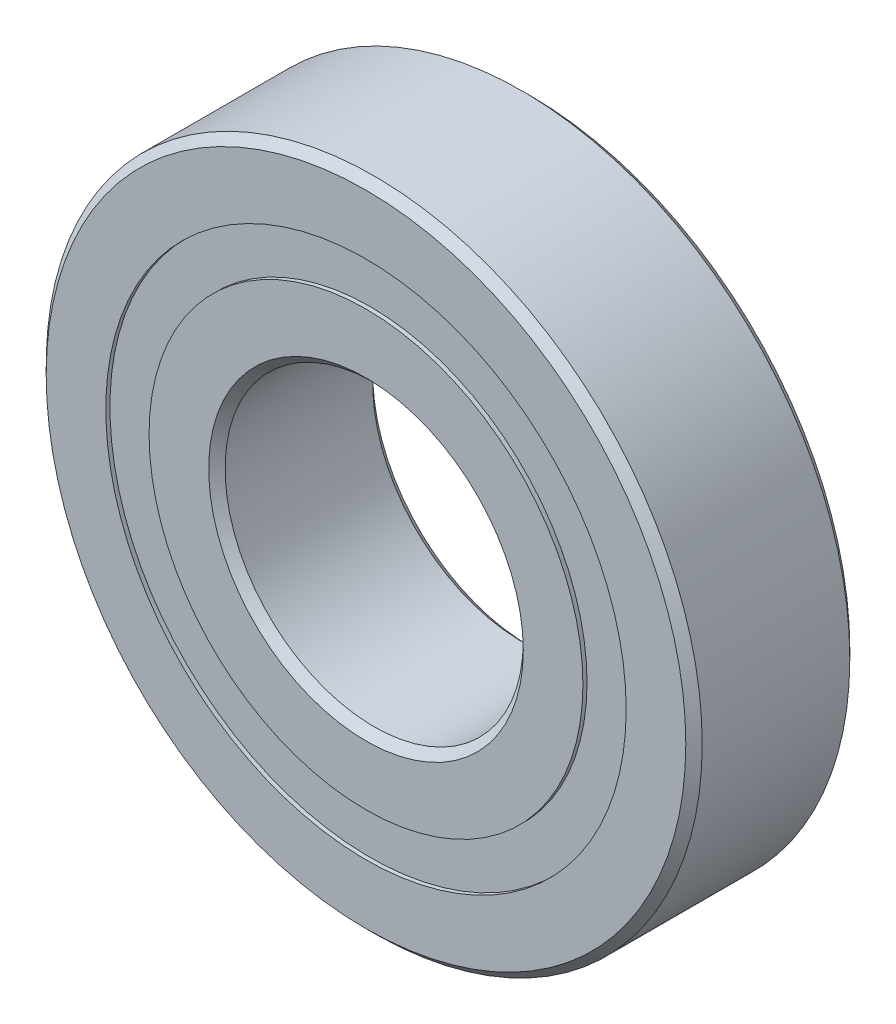
ISO-10303-21;
HEADER;
FILE_DESCRIPTION(('STEP AP214'),'2;1');
FILE_NAME('part.step','',(''),(''),'','','');
FILE_SCHEMA(('AUTOMOTIVE_DESIGN { 1 0 10303 214 1 1 1 1 }'));
ENDSEC;
DATA;
#1=APPLICATION_CONTEXT('core data for automotive mechanical design processes');
#2=APPLICATION_PROTOCOL_DEFINITION('international standard','automotive_design',2000,#1);
#3=PRODUCT_CONTEXT('',#1,'mechanical');
#4=PRODUCT('Part','Part','',(#3));
#5=PRODUCT_RELATED_PRODUCT_CATEGORY('part','',(#4));
#6=PRODUCT_DEFINITION_FORMATION('','',#4);
#7=PRODUCT_DEFINITION_CONTEXT('part definition',#1,'design');
#8=PRODUCT_DEFINITION('design','',#6,#7);
#9=PRODUCT_DEFINITION_SHAPE('','',#8);
#10=(LENGTH_UNIT() NAMED_UNIT(*) SI_UNIT(.MILLI.,.METRE.));
#11=(NAMED_UNIT(*) PLANE_ANGLE_UNIT() SI_UNIT($,.RADIAN.));
#12=(NAMED_UNIT(*) SI_UNIT($,.STERADIAN.) SOLID_ANGLE_UNIT());
#13=UNCERTAINTY_MEASURE_WITH_UNIT(LENGTH_MEASURE(1.E-05),#10,'distance_accuracy_value','');
#14=(GEOMETRIC_REPRESENTATION_CONTEXT(3) GLOBAL_UNCERTAINTY_ASSIGNED_CONTEXT((#13)) GLOBAL_UNIT_ASSIGNED_CONTEXT((#10,
#11,#12)) REPRESENTATION_CONTEXT('',''));
#15=CARTESIAN_POINT('',(0.,0.,0.));
#16=DIRECTION('',(0.,0.,1.));
#17=DIRECTION('',(1.,0.,0.));
#18=AXIS2_PLACEMENT_3D('',#15,#16,#17);
#19=CARTESIAN_POINT('',(0.,13.8513736263736,-4.14734375));
#20=DIRECTION('',(0.,0.,1.));
#21=DIRECTION('',(1.,0.,0.));
#22=AXIS2_PLACEMENT_3D('',#19,#20,#21);
#23=PLANE('',#22);
#24=CARTESIAN_POINT('',(0.,0.,-4.14734375));
#25=DIRECTION('',(0.,0.,1.));
#26=DIRECTION('',(1.,0.,0.));
#27=AXIS2_PLACEMENT_3D('',#24,#25,#26);
#28=CIRCLE('',#27,13.8513736263736);
#29=CARTESIAN_POINT('',(13.8513736263736,0.,-4.14734375));
#30=VERTEX_POINT('',#29);
#31=EDGE_CURVE('E69',#30,#30,#28,.T.);
#32=ORIENTED_EDGE('',*,*,#31,.F.);
#33=EDGE_LOOP('',(#32));
#34=FACE_BOUND('',#33,.T.);
#35=CARTESIAN_POINT('',(0.,0.,-4.14734375));
#36=DIRECTION('',(0.,0.,1.));
#37=DIRECTION('',(1.,0.,0.));
#38=AXIS2_PLACEMENT_3D('',#35,#36,#37);
#39=CIRCLE('',#38,11.5486263736264);
#40=CARTESIAN_POINT('',(11.5486263736264,0.,-4.14734375));
#41=VERTEX_POINT('',#40);
#42=EDGE_CURVE('E13',#41,#41,#39,.T.);
#43=ORIENTED_EDGE('',*,*,#42,.T.);
#44=EDGE_LOOP('',(#43));
#45=FACE_BOUND('',#44,.T.);
#46=ADVANCED_FACE('F55',(#34,#45),#23,.F.);
#47=CARTESIAN_POINT('',(0.,0.,4.365625));
#48=DIRECTION('',(0.,0.,1.));
#49=DIRECTION('',(1.,0.,0.));
#50=AXIS2_PLACEMENT_3D('',#47,#48,#49);
#51=CYLINDRICAL_SURFACE('',#50,11.5486263736264);
#52=ORIENTED_EDGE('',*,*,#42,.F.);
#53=EDGE_LOOP('',(#52));
#54=FACE_BOUND('',#53,.T.);
#55=CARTESIAN_POINT('',(0.,0.,-2.25617798111032));
#56=DIRECTION('',(0.,0.,1.));
#57=DIRECTION('',(1.,0.,0.));
#58=AXIS2_PLACEMENT_3D('',#55,#56,#57);
#59=CIRCLE('',#58,11.5486263736264);
#60=CARTESIAN_POINT('',(11.5486263736264,0.,-2.25617798111032));
#61=VERTEX_POINT('',#60);
#62=EDGE_CURVE('E61',#61,#61,#59,.T.);
#63=ORIENTED_EDGE('',*,*,#62,.T.);
#64=EDGE_LOOP('',(#63));
#65=FACE_BOUND('',#64,.T.);
#66=ADVANCED_FACE('F78',(#54,#65),#51,.F.);
#67=CARTESIAN_POINT('',(0.,13.8513736263736,-2.25617798111032));
#68=DIRECTION('',(0.,0.,-1.));
#69=DIRECTION('',(-1.,0.,0.));
#70=AXIS2_PLACEMENT_3D('',#67,#68,#69);
#71=PLANE('',#70);
#72=ORIENTED_EDGE('',*,*,#62,.F.);
#73=EDGE_LOOP('',(#72));
#74=FACE_BOUND('',#73,.T.);
#75=CARTESIAN_POINT('',(0.,0.,-2.25617798111032));
#76=DIRECTION('',(0.,0.,1.));
#77=DIRECTION('',(1.,0.,0.));
#78=AXIS2_PLACEMENT_3D('',#75,#76,#77);
#79=CIRCLE('',#78,13.8513736263736);
#80=CARTESIAN_POINT('',(13.8513736263736,0.,-2.25617798111032));
#81=VERTEX_POINT('',#80);
#82=EDGE_CURVE('E65',#81,#81,#79,.T.);
#83=ORIENTED_EDGE('',*,*,#82,.T.);
#84=EDGE_LOOP('',(#83));
#85=FACE_BOUND('',#84,.T.);
#86=ADVANCED_FACE('F82',(#74,#85),#71,.F.);
#87=CARTESIAN_POINT('',(0.,0.,4.365625));
#88=DIRECTION('',(0.,0.,1.));
#89=DIRECTION('',(1.,0.,0.));
#90=AXIS2_PLACEMENT_3D('',#87,#88,#89);
#91=CYLINDRICAL_SURFACE('',#90,13.8513736263736);
#92=ORIENTED_EDGE('',*,*,#82,.F.);
#93=EDGE_LOOP('',(#92));
#94=FACE_BOUND('',#93,.T.);
#95=ORIENTED_EDGE('',*,*,#31,.T.);
#96=EDGE_LOOP('',(#95));
#97=FACE_BOUND('',#96,.T.);
#98=ADVANCED_FACE('F75',(#94,#97),#91,.T.);
#99=CLOSED_SHELL('',(#46,#66,#86,#98));
#100=MANIFOLD_SOLID_BREP('B2',#99);
#101=CARTESIAN_POINT('',(0.,13.8513736263736,4.14734375));
#102=DIRECTION('',(0.,0.,-1.));
#103=DIRECTION('',(-1.,0.,0.));
#104=AXIS2_PLACEMENT_3D('',#101,#102,#103);
#105=PLANE('',#104);
#106=CARTESIAN_POINT('',(0.,0.,4.14734375));
#107=DIRECTION('',(0.,0.,1.));
#108=DIRECTION('',(1.,0.,0.));
#109=AXIS2_PLACEMENT_3D('',#106,#107,#108);
#110=CIRCLE('',#109,11.5486263736264);
#111=CARTESIAN_POINT('',(11.5486263736264,0.,4.14734375));
#112=VERTEX_POINT('',#111);
#113=EDGE_CURVE('E54',#112,#112,#110,.T.);
#114=ORIENTED_EDGE('',*,*,#113,.F.);
#115=EDGE_LOOP('',(#114));
#116=FACE_BOUND('',#115,.T.);
#117=CARTESIAN_POINT('',(0.,0.,4.14734375));
#118=DIRECTION('',(0.,0.,1.));
#119=DIRECTION('',(1.,0.,0.));
#120=AXIS2_PLACEMENT_3D('',#117,#118,#119);
#121=CIRCLE('',#120,13.8513736263736);
#122=CARTESIAN_POINT('',(13.8513736263736,0.,4.14734375));
#123=VERTEX_POINT('',#122);
#124=EDGE_CURVE('E142',#123,#123,#121,.T.);
#125=ORIENTED_EDGE('',*,*,#124,.T.);
#126=EDGE_LOOP('',(#125));
#127=FACE_BOUND('',#126,.T.);
#128=ADVANCED_FACE('F128',(#116,#127),#105,.F.);
#129=CARTESIAN_POINT('',(0.,0.,4.365625));
#130=DIRECTION('',(0.,0.,1.));
#131=DIRECTION('',(1.,0.,0.));
#132=AXIS2_PLACEMENT_3D('',#129,#130,#131);
#133=CYLINDRICAL_SURFACE('',#132,11.5486263736264);
#134=CARTESIAN_POINT('',(0.,0.,2.25617798111032));
#135=DIRECTION('',(0.,0.,1.));
#136=DIRECTION('',(1.,0.,0.));
#137=AXIS2_PLACEMENT_3D('',#134,#135,#136);
#138=CIRCLE('',#137,11.5486263736264);
#139=CARTESIAN_POINT('',(11.5486263736264,0.,2.25617798111032));
#140=VERTEX_POINT('',#139);
#141=EDGE_CURVE('E134',#140,#140,#138,.T.);
#142=ORIENTED_EDGE('',*,*,#141,.F.);
#143=EDGE_LOOP('',(#142));
#144=FACE_BOUND('',#143,.T.);
#145=ORIENTED_EDGE('',*,*,#113,.T.);
#146=EDGE_LOOP('',(#145));
#147=FACE_BOUND('',#146,.T.);
#148=ADVANCED_FACE('F157',(#144,#147),#133,.F.);
#149=CARTESIAN_POINT('',(0.,13.8513736263736,2.25617798111032));
#150=DIRECTION('',(0.,0.,1.));
#151=DIRECTION('',(1.,0.,0.));
#152=AXIS2_PLACEMENT_3D('',#149,#150,#151);
#153=PLANE('',#152);
#154=CARTESIAN_POINT('',(0.,0.,2.25617798111032));
#155=DIRECTION('',(0.,0.,1.));
#156=DIRECTION('',(1.,0.,0.));
#157=AXIS2_PLACEMENT_3D('',#154,#155,#156);
#158=CIRCLE('',#157,13.8513736263736);
#159=CARTESIAN_POINT('',(13.8513736263736,0.,2.25617798111032));
#160=VERTEX_POINT('',#159);
#161=EDGE_CURVE('E138',#160,#160,#158,.T.);
#162=ORIENTED_EDGE('',*,*,#161,.F.);
#163=EDGE_LOOP('',(#162));
#164=FACE_BOUND('',#163,.T.);
#165=ORIENTED_EDGE('',*,*,#141,.T.);
#166=EDGE_LOOP('',(#165));
#167=FACE_BOUND('',#166,.T.);
#168=ADVANCED_FACE('F152',(#164,#167),#153,.F.);
#169=CARTESIAN_POINT('',(0.,0.,4.365625));
#170=DIRECTION('',(0.,0.,1.));
#171=DIRECTION('',(1.,0.,0.));
#172=AXIS2_PLACEMENT_3D('',#169,#170,#171);
#173=CYLINDRICAL_SURFACE('',#172,13.8513736263736);
#174=ORIENTED_EDGE('',*,*,#124,.F.);
#175=EDGE_LOOP('',(#174));
#176=FACE_BOUND('',#175,.T.);
#177=ORIENTED_EDGE('',*,*,#161,.T.);
#178=EDGE_LOOP('',(#177));
#179=FACE_BOUND('',#178,.T.);
#180=ADVANCED_FACE('F149',(#176,#179),#173,.T.);
#181=CLOSED_SHELL('',(#128,#148,#168,#180));
#182=MANIFOLD_SOLID_BREP('B8',#181);
#183=CARTESIAN_POINT('',(-7.46487270411427,10.2745158285619,0.));
#184=DIRECTION('',(0.,0.,1.));
#185=DIRECTION('',(-0.587785252292462,0.809016994374955,0.));
#186=AXIS2_PLACEMENT_3D('',#183,#184,#185);
#187=SPHERICAL_SURFACE('',#186,2.25617798111032);
#188=CARTESIAN_POINT('',(-7.46487270411427,10.2745158285619,2.25617798111032));
#189=VERTEX_POINT('',#188);
#190=VERTEX_LOOP('',#189);
#191=FACE_BOUND('',#190,.T.);
#192=ADVANCED_FACE('F195',(#191),#187,.T.);
#193=CLOSED_SHELL('',(#192));
#194=MANIFOLD_SOLID_BREP('B49',#193);
#195=CARTESIAN_POINT('',(-12.0784177569484,3.92451582856197,0.));
#196=DIRECTION('',(0.,0.,1.));
#197=DIRECTION('',(-0.95105651629515,0.309016994374958,0.));
#198=AXIS2_PLACEMENT_3D('',#195,#196,#197);
#199=SPHERICAL_SURFACE('',#198,2.25617798111032);
#200=CARTESIAN_POINT('',(-12.0784177569484,3.92451582856197,2.25617798111032));
#201=VERTEX_POINT('',#200);
#202=VERTEX_LOOP('',#201);
#203=FACE_BOUND('',#202,.T.);
#204=ADVANCED_FACE('F215',(#203),#199,.T.);
#205=CLOSED_SHELL('',(#204));
#206=MANIFOLD_SOLID_BREP('B124',#205);
#207=CARTESIAN_POINT('',(-12.0784177569485,-3.92451582856172,0.));
#208=DIRECTION('',(0.,0.,1.));
#209=DIRECTION('',(-0.951056516295157,-0.309016994374938,0.));
#210=AXIS2_PLACEMENT_3D('',#207,#208,#209);
#211=SPHERICAL_SURFACE('',#210,2.25617798111032);
#212=CARTESIAN_POINT('',(-12.0784177569485,-3.92451582856172,2.25617798111032));
#213=VERTEX_POINT('',#212);
#214=VERTEX_LOOP('',#213);
#215=FACE_BOUND('',#214,.T.);
#216=ADVANCED_FACE('F235',(#215),#211,.T.);
#217=CLOSED_SHELL('',(#216));
#218=MANIFOLD_SOLID_BREP('B191',#217);
#219=CARTESIAN_POINT('',(-7.4648727041145,-10.2745158285618,0.));
#220=DIRECTION('',(0.,0.,1.));
#221=DIRECTION('',(-0.58778525229248,-0.809016994374942,0.));
#222=AXIS2_PLACEMENT_3D('',#219,#220,#221);
#223=SPHERICAL_SURFACE('',#222,2.25617798111032);
#224=CARTESIAN_POINT('',(-7.4648727041145,-10.2745158285618,2.25617798111032));
#225=VERTEX_POINT('',#224);
#226=VERTEX_LOOP('',#225);
#227=FACE_BOUND('',#226,.T.);
#228=ADVANCED_FACE('F255',(#227),#223,.T.);
#229=CLOSED_SHELL('',(#228));
#230=MANIFOLD_SOLID_BREP('B211',#229);
#231=CARTESIAN_POINT('',(0.,-12.7,0.));
#232=DIRECTION('',(0.,0.,1.));
#233=DIRECTION('',(0.,-1.,0.));
#234=AXIS2_PLACEMENT_3D('',#231,#232,#233);
#235=SPHERICAL_SURFACE('',#234,2.25617798111032);
#236=CARTESIAN_POINT('',(0.,-12.7,2.25617798111032));
#237=VERTEX_POINT('',#236);
#238=VERTEX_LOOP('',#237);
#239=FACE_BOUND('',#238,.T.);
#240=ADVANCED_FACE('F275',(#239),#235,.T.);
#241=CLOSED_SHELL('',(#240));
#242=MANIFOLD_SOLID_BREP('B231',#241);
#243=CARTESIAN_POINT('',(7.46487270411435,-10.2745158285619,0.));
#244=DIRECTION('',(0.,0.,1.));
#245=DIRECTION('',(0.587785252292469,-0.809016994374951,0.));
#246=AXIS2_PLACEMENT_3D('',#243,#244,#245);
#247=SPHERICAL_SURFACE('',#246,2.25617798111032);
#248=CARTESIAN_POINT('',(7.46487270411435,-10.2745158285619,2.25617798111032));
#249=VERTEX_POINT('',#248);
#250=VERTEX_LOOP('',#249);
#251=FACE_BOUND('',#250,.T.);
#252=ADVANCED_FACE('F295',(#251),#247,.T.);
#253=CLOSED_SHELL('',(#252));
#254=MANIFOLD_SOLID_BREP('B251',#253);
#255=CARTESIAN_POINT('',(12.0784177569484,-3.92451582856189,0.));
#256=DIRECTION('',(0.,0.,1.));
#257=DIRECTION('',(0.951056516295152,-0.309016994374952,0.));
#258=AXIS2_PLACEMENT_3D('',#255,#256,#257);
#259=SPHERICAL_SURFACE('',#258,2.25617798111032);
#260=CARTESIAN_POINT('',(12.0784177569484,-3.92451582856189,2.25617798111032));
#261=VERTEX_POINT('',#260);
#262=VERTEX_LOOP('',#261);
#263=FACE_BOUND('',#262,.T.);
#264=ADVANCED_FACE('F315',(#263),#259,.T.);
#265=CLOSED_SHELL('',(#264));
#266=MANIFOLD_SOLID_BREP('B271',#265);
#267=CARTESIAN_POINT('',(12.0784177569485,3.9245158285618,0.));
#268=DIRECTION('',(0.,0.,1.));
#269=DIRECTION('',(0.951056516295155,0.309016994374945,0.));
#270=AXIS2_PLACEMENT_3D('',#267,#268,#269);
#271=SPHERICAL_SURFACE('',#270,2.25617798111032);
#272=CARTESIAN_POINT('',(12.0784177569485,3.9245158285618,2.25617798111032));
#273=VERTEX_POINT('',#272);
#274=VERTEX_LOOP('',#273);
#275=FACE_BOUND('',#274,.T.);
#276=ADVANCED_FACE('F335',(#275),#271,.T.);
#277=CLOSED_SHELL('',(#276));
#278=MANIFOLD_SOLID_BREP('B291',#277);
#279=CARTESIAN_POINT('',(7.46487270411442,10.2745158285618,0.));
#280=DIRECTION('',(0.,0.,1.));
#281=DIRECTION('',(0.587785252292474,0.809016994374947,0.));
#282=AXIS2_PLACEMENT_3D('',#279,#280,#281);
#283=SPHERICAL_SURFACE('',#282,2.25617798111032);
#284=CARTESIAN_POINT('',(7.46487270411442,10.2745158285618,2.25617798111032));
#285=VERTEX_POINT('',#284);
#286=VERTEX_LOOP('',#285);
#287=FACE_BOUND('',#286,.T.);
#288=ADVANCED_FACE('F355',(#287),#283,.T.);
#289=CLOSED_SHELL('',(#288));
#290=MANIFOLD_SOLID_BREP('B311',#289);
#291=CARTESIAN_POINT('',(0.,12.7,0.));
#292=DIRECTION('',(0.,0.,1.));
#293=DIRECTION('',(0.,1.,0.));
#294=AXIS2_PLACEMENT_3D('',#291,#292,#293);
#295=SPHERICAL_SURFACE('',#294,2.25617798111032);
#296=CARTESIAN_POINT('',(0.,12.7,2.25617798111032));
#297=VERTEX_POINT('',#296);
#298=VERTEX_LOOP('',#297);
#299=FACE_BOUND('',#298,.T.);
#300=ADVANCED_FACE('F379',(#299),#295,.T.);
#301=CLOSED_SHELL('',(#300));
#302=MANIFOLD_SOLID_BREP('B331',#301);
#303=CARTESIAN_POINT('',(0.,11.5486263736264,4.365625));
#304=DIRECTION('',(0.,0.,-1.));
#305=DIRECTION('',(-1.,0.,0.));
#306=AXIS2_PLACEMENT_3D('',#303,#304,#305);
#307=PLANE('',#306);
#308=CARTESIAN_POINT('',(0.,0.,4.365625));
#309=DIRECTION('',(0.,0.,1.));
#310=DIRECTION('',(1.,0.,0.));
#311=AXIS2_PLACEMENT_3D('',#308,#309,#310);
#312=CIRCLE('',#311,8.3740625);
#313=CARTESIAN_POINT('',(8.3740625,0.,4.365625));
#314=VERTEX_POINT('',#313);
#315=EDGE_CURVE('E434',#314,#314,#312,.T.);
#316=ORIENTED_EDGE('',*,*,#315,.F.);
#317=EDGE_LOOP('',(#316));
#318=FACE_BOUND('',#317,.T.);
#319=CARTESIAN_POINT('',(0.,0.,4.365625));
#320=DIRECTION('',(0.,0.,1.));
#321=DIRECTION('',(1.,0.,0.));
#322=AXIS2_PLACEMENT_3D('',#319,#320,#321);
#323=CIRCLE('',#322,11.5486263736264);
#324=CARTESIAN_POINT('',(11.5486263736264,0.,4.365625));
#325=VERTEX_POINT('',#324);
#326=EDGE_CURVE('E378',#325,#325,#323,.T.);
#327=ORIENTED_EDGE('',*,*,#326,.T.);
#328=EDGE_LOOP('',(#327));
#329=FACE_BOUND('',#328,.T.);
#330=ADVANCED_FACE('F406',(#318,#329),#307,.F.);
#331=CARTESIAN_POINT('',(0.,0.,4.365625));
#332=DIRECTION('',(0.,0.,1.));
#333=DIRECTION('',(1.,0.,0.));
#334=AXIS2_PLACEMENT_3D('',#331,#332,#333);
#335=CYLINDRICAL_SURFACE('',#334,11.5486263736264);
#336=ORIENTED_EDGE('',*,*,#326,.F.);
#337=EDGE_LOOP('',(#336));
#338=FACE_BOUND('',#337,.T.);
#339=CARTESIAN_POINT('',(0.,0.,1.94027777777778));
#340=DIRECTION('',(0.,0.,1.));
#341=DIRECTION('',(1.,0.,0.));
#342=AXIS2_PLACEMENT_3D('',#339,#340,#341);
#343=CIRCLE('',#342,11.5486263736264);
#344=CARTESIAN_POINT('',(11.5486263736264,0.,1.94027777777778));
#345=VERTEX_POINT('',#344);
#346=EDGE_CURVE('E412',#345,#345,#343,.T.);
#347=ORIENTED_EDGE('',*,*,#346,.T.);
#348=EDGE_LOOP('',(#347));
#349=FACE_BOUND('',#348,.T.);
#350=ADVANCED_FACE('F441',(#338,#349),#335,.T.);
#351=CARTESIAN_POINT('',(0.,0.,0.));
#352=DIRECTION('',(0.,0.,1.));
#353=DIRECTION('',(1.,0.,0.));
#354=AXIS2_PLACEMENT_3D('',#351,#352,#353);
#355=TOROIDAL_SURFACE('',#354,12.7,2.25617798111031);
#356=ORIENTED_EDGE('',*,*,#346,.F.);
#357=EDGE_LOOP('',(#356));
#358=FACE_BOUND('',#357,.T.);
#359=CARTESIAN_POINT('',(0.,0.,-1.94027777777778));
#360=DIRECTION('',(0.,0.,1.));
#361=DIRECTION('',(1.,0.,0.));
#362=AXIS2_PLACEMENT_3D('',#359,#360,#361);
#363=CIRCLE('',#362,11.5486263736264);
#364=CARTESIAN_POINT('',(11.5486263736264,0.,-1.94027777777778));
#365=VERTEX_POINT('',#364);
#366=EDGE_CURVE('E416',#365,#365,#363,.T.);
#367=ORIENTED_EDGE('',*,*,#366,.T.);
#368=EDGE_LOOP('',(#367));
#369=FACE_BOUND('',#368,.T.);
#370=ADVANCED_FACE('F445',(#358,#369),#355,.F.);
#371=CARTESIAN_POINT('',(0.,0.,4.365625));
#372=DIRECTION('',(0.,0.,1.));
#373=DIRECTION('',(1.,0.,0.));
#374=AXIS2_PLACEMENT_3D('',#371,#372,#373);
#375=CYLINDRICAL_SURFACE('',#374,11.5486263736264);
#376=ORIENTED_EDGE('',*,*,#366,.F.);
#377=EDGE_LOOP('',(#376));
#378=FACE_BOUND('',#377,.T.);
#379=CARTESIAN_POINT('',(0.,0.,-4.365625));
#380=DIRECTION('',(0.,0.,1.));
#381=DIRECTION('',(1.,0.,0.));
#382=AXIS2_PLACEMENT_3D('',#379,#380,#381);
#383=CIRCLE('',#382,11.5486263736264);
#384=CARTESIAN_POINT('',(11.5486263736264,0.,-4.365625));
#385=VERTEX_POINT('',#384);
#386=EDGE_CURVE('E420',#385,#385,#383,.T.);
#387=ORIENTED_EDGE('',*,*,#386,.T.);
#388=EDGE_LOOP('',(#387));
#389=FACE_BOUND('',#388,.T.);
#390=ADVANCED_FACE('F450',(#378,#389),#375,.T.);
#391=CARTESIAN_POINT('',(0.,8.3740625,-4.365625));
#392=DIRECTION('',(0.,0.,1.));
#393=DIRECTION('',(1.,0.,0.));
#394=AXIS2_PLACEMENT_3D('',#391,#392,#393);
#395=PLANE('',#394);
#396=ORIENTED_EDGE('',*,*,#386,.F.);
#397=EDGE_LOOP('',(#396));
#398=FACE_BOUND('',#397,.T.);
#399=CARTESIAN_POINT('',(0.,0.,-4.365625));
#400=DIRECTION('',(0.,0.,1.));
#401=DIRECTION('',(1.,0.,0.));
#402=AXIS2_PLACEMENT_3D('',#399,#400,#401);
#403=CIRCLE('',#402,8.3740625);
#404=CARTESIAN_POINT('',(8.3740625,0.,-4.365625));
#405=VERTEX_POINT('',#404);
#406=EDGE_CURVE('E425',#405,#405,#403,.T.);
#407=ORIENTED_EDGE('',*,*,#406,.T.);
#408=EDGE_LOOP('',(#407));
#409=FACE_BOUND('',#408,.T.);
#410=ADVANCED_FACE('F456',(#398,#409),#395,.F.);
#411=CARTESIAN_POINT('',(0.,0.,-3.9290625));
#412=DIRECTION('',(0.,0.,-1.));
#413=DIRECTION('',(-1.,0.,0.));
#414=AXIS2_PLACEMENT_3D('',#411,#412,#413);
#415=CONICAL_SURFACE('',#414,7.9375,0.785398163397446);
#416=ORIENTED_EDGE('',*,*,#406,.F.);
#417=EDGE_LOOP('',(#416));
#418=FACE_BOUND('',#417,.T.);
#419=CARTESIAN_POINT('',(0.,0.,-3.9290625));
#420=DIRECTION('',(0.,0.,1.));
#421=DIRECTION('',(1.,0.,0.));
#422=AXIS2_PLACEMENT_3D('',#419,#420,#421);
#423=CIRCLE('',#422,7.9375);
#424=CARTESIAN_POINT('',(7.9375,0.,-3.9290625));
#425=VERTEX_POINT('',#424);
#426=EDGE_CURVE('E428',#425,#425,#423,.T.);
#427=ORIENTED_EDGE('',*,*,#426,.T.);
#428=EDGE_LOOP('',(#427));
#429=FACE_BOUND('',#428,.T.);
#430=ADVANCED_FACE('F460',(#418,#429),#415,.F.);
#431=CARTESIAN_POINT('',(0.,0.,4.365625));
#432=DIRECTION('',(0.,0.,1.));
#433=DIRECTION('',(1.,0.,0.));
#434=AXIS2_PLACEMENT_3D('',#431,#432,#433);
#435=CYLINDRICAL_SURFACE('',#434,7.9375);
#436=ORIENTED_EDGE('',*,*,#426,.F.);
#437=EDGE_LOOP('',(#436));
#438=FACE_BOUND('',#437,.T.);
#439=CARTESIAN_POINT('',(0.,0.,3.9290625));
#440=DIRECTION('',(0.,0.,1.));
#441=DIRECTION('',(1.,0.,0.));
#442=AXIS2_PLACEMENT_3D('',#439,#440,#441);
#443=CIRCLE('',#442,7.9375);
#444=CARTESIAN_POINT('',(7.9375,0.,3.9290625));
#445=VERTEX_POINT('',#444);
#446=EDGE_CURVE('E431',#445,#445,#443,.T.);
#447=ORIENTED_EDGE('',*,*,#446,.T.);
#448=EDGE_LOOP('',(#447));
#449=FACE_BOUND('',#448,.T.);
#450=ADVANCED_FACE('F464',(#438,#449),#435,.F.);
#451=CARTESIAN_POINT('',(0.,0.,4.365625));
#452=DIRECTION('',(0.,0.,1.));
#453=DIRECTION('',(1.,0.,0.));
#454=AXIS2_PLACEMENT_3D('',#451,#452,#453);
#455=CONICAL_SURFACE('',#454,8.3740625,0.785398163397447);
#456=ORIENTED_EDGE('',*,*,#446,.F.);
#457=EDGE_LOOP('',(#456));
#458=FACE_BOUND('',#457,.T.);
#459=ORIENTED_EDGE('',*,*,#315,.T.);
#460=EDGE_LOOP('',(#459));
#461=FACE_BOUND('',#460,.T.);
#462=ADVANCED_FACE('F438',(#458,#461),#455,.F.);
#463=CLOSED_SHELL('',(#330,#350,#370,#390,#410,#430,#450,#462));
#464=MANIFOLD_SOLID_BREP('B351',#463);
#465=CARTESIAN_POINT('',(0.,0.,3.9290625));
#466=DIRECTION('',(0.,0.,-1.));
#467=DIRECTION('',(-1.,0.,0.));
#468=AXIS2_PLACEMENT_3D('',#465,#466,#467);
#469=CONICAL_SURFACE('',#468,17.4625,0.785398163397445);
#470=CARTESIAN_POINT('',(0.,0.,4.365625));
#471=DIRECTION('',(0.,0.,1.));
#472=DIRECTION('',(1.,0.,0.));
#473=AXIS2_PLACEMENT_3D('',#470,#471,#472);
#474=CIRCLE('',#473,17.0259375);
#475=CARTESIAN_POINT('',(17.0259375,0.,4.365625));
#476=VERTEX_POINT('',#475);
#477=EDGE_CURVE('E561',#476,#476,#474,.T.);
#478=ORIENTED_EDGE('',*,*,#477,.F.);
#479=EDGE_LOOP('',(#478));
#480=FACE_BOUND('',#479,.T.);
#481=CARTESIAN_POINT('',(0.,0.,3.9290625));
#482=DIRECTION('',(0.,0.,1.));
#483=DIRECTION('',(1.,0.,0.));
#484=AXIS2_PLACEMENT_3D('',#481,#482,#483);
#485=CIRCLE('',#484,17.4625);
#486=CARTESIAN_POINT('',(17.4625,0.,3.9290625));
#487=VERTEX_POINT('',#486);
#488=EDGE_CURVE('E405',#487,#487,#485,.T.);
#489=ORIENTED_EDGE('',*,*,#488,.T.);
#490=EDGE_LOOP('',(#489));
#491=FACE_BOUND('',#490,.T.);
#492=ADVANCED_FACE('F533',(#480,#491),#469,.T.);
#493=CARTESIAN_POINT('',(0.,0.,4.365625));
#494=DIRECTION('',(0.,0.,1.));
#495=DIRECTION('',(1.,0.,0.));
#496=AXIS2_PLACEMENT_3D('',#493,#494,#495);
#497=CYLINDRICAL_SURFACE('',#496,17.4625);
#498=ORIENTED_EDGE('',*,*,#488,.F.);
#499=EDGE_LOOP('',(#498));
#500=FACE_BOUND('',#499,.T.);
#501=CARTESIAN_POINT('',(0.,0.,-3.9290625));
#502=DIRECTION('',(0.,0.,1.));
#503=DIRECTION('',(1.,0.,0.));
#504=AXIS2_PLACEMENT_3D('',#501,#502,#503);
#505=CIRCLE('',#504,17.4625);
#506=CARTESIAN_POINT('',(17.4625,0.,-3.9290625));
#507=VERTEX_POINT('',#506);
#508=EDGE_CURVE('E539',#507,#507,#505,.T.);
#509=ORIENTED_EDGE('',*,*,#508,.T.);
#510=EDGE_LOOP('',(#509));
#511=FACE_BOUND('',#510,.T.);
#512=ADVANCED_FACE('F568',(#500,#511),#497,.T.);
#513=CARTESIAN_POINT('',(0.,0.,-4.365625));
#514=DIRECTION('',(0.,0.,1.));
#515=DIRECTION('',(1.,0.,0.));
#516=AXIS2_PLACEMENT_3D('',#513,#514,#515);
#517=CONICAL_SURFACE('',#516,17.0259375,0.785398163397446);
#518=ORIENTED_EDGE('',*,*,#508,.F.);
#519=EDGE_LOOP('',(#518));
#520=FACE_BOUND('',#519,.T.);
#521=CARTESIAN_POINT('',(0.,0.,-4.365625));
#522=DIRECTION('',(0.,0.,1.));
#523=DIRECTION('',(1.,0.,0.));
#524=AXIS2_PLACEMENT_3D('',#521,#522,#523);
#525=CIRCLE('',#524,17.0259375);
#526=CARTESIAN_POINT('',(17.0259375,0.,-4.365625));
#527=VERTEX_POINT('',#526);
#528=EDGE_CURVE('E543',#527,#527,#525,.T.);
#529=ORIENTED_EDGE('',*,*,#528,.T.);
#530=EDGE_LOOP('',(#529));
#531=FACE_BOUND('',#530,.T.);
#532=ADVANCED_FACE('F572',(#520,#531),#517,.T.);
#533=CARTESIAN_POINT('',(0.,17.0259375,-4.365625));
#534=DIRECTION('',(0.,0.,1.));
#535=DIRECTION('',(1.,0.,0.));
#536=AXIS2_PLACEMENT_3D('',#533,#534,#535);
#537=PLANE('',#536);
#538=ORIENTED_EDGE('',*,*,#528,.F.);
#539=EDGE_LOOP('',(#538));
#540=FACE_BOUND('',#539,.T.);
#541=CARTESIAN_POINT('',(0.,0.,-4.365625));
#542=DIRECTION('',(0.,0.,1.));
#543=DIRECTION('',(1.,0.,0.));
#544=AXIS2_PLACEMENT_3D('',#541,#542,#543);
#545=CIRCLE('',#544,13.8513736263736);
#546=CARTESIAN_POINT('',(13.8513736263736,0.,-4.365625));
#547=VERTEX_POINT('',#546);
#548=EDGE_CURVE('E547',#547,#547,#545,.T.);
#549=ORIENTED_EDGE('',*,*,#548,.T.);
#550=EDGE_LOOP('',(#549));
#551=FACE_BOUND('',#550,.T.);
#552=ADVANCED_FACE('F577',(#540,#551),#537,.F.);
#553=CARTESIAN_POINT('',(0.,0.,4.365625));
#554=DIRECTION('',(0.,0.,1.));
#555=DIRECTION('',(1.,0.,0.));
#556=AXIS2_PLACEMENT_3D('',#553,#554,#555);
#557=CYLINDRICAL_SURFACE('',#556,13.8513736263736);
#558=ORIENTED_EDGE('',*,*,#548,.F.);
#559=EDGE_LOOP('',(#558));
#560=FACE_BOUND('',#559,.T.);
#561=CARTESIAN_POINT('',(0.,0.,-1.94027777777778));
#562=DIRECTION('',(0.,0.,1.));
#563=DIRECTION('',(1.,0.,0.));
#564=AXIS2_PLACEMENT_3D('',#561,#562,#563);
#565=CIRCLE('',#564,13.8513736263736);
#566=CARTESIAN_POINT('',(13.8513736263736,0.,-1.94027777777778));
#567=VERTEX_POINT('',#566);
#568=EDGE_CURVE('E552',#567,#567,#565,.T.);
#569=ORIENTED_EDGE('',*,*,#568,.T.);
#570=EDGE_LOOP('',(#569));
#571=FACE_BOUND('',#570,.T.);
#572=ADVANCED_FACE('F583',(#560,#571),#557,.F.);
#573=CARTESIAN_POINT('',(0.,0.,0.));
#574=DIRECTION('',(0.,0.,1.));
#575=DIRECTION('',(1.,0.,0.));
#576=AXIS2_PLACEMENT_3D('',#573,#574,#575);
#577=TOROIDAL_SURFACE('',#576,12.7,2.25617798111032);
#578=ORIENTED_EDGE('',*,*,#568,.F.);
#579=EDGE_LOOP('',(#578));
#580=FACE_BOUND('',#579,.T.);
#581=CARTESIAN_POINT('',(0.,0.,1.94027777777778));
#582=DIRECTION('',(0.,0.,1.));
#583=DIRECTION('',(1.,0.,0.));
#584=AXIS2_PLACEMENT_3D('',#581,#582,#583);
#585=CIRCLE('',#584,13.8513736263736);
#586=CARTESIAN_POINT('',(13.8513736263736,0.,1.94027777777778));
#587=VERTEX_POINT('',#586);
#588=EDGE_CURVE('E555',#587,#587,#585,.T.);
#589=ORIENTED_EDGE('',*,*,#588,.T.);
#590=EDGE_LOOP('',(#589));
#591=FACE_BOUND('',#590,.T.);
#592=ADVANCED_FACE('F587',(#580,#591),#577,.F.);
#593=CARTESIAN_POINT('',(0.,0.,4.365625));
#594=DIRECTION('',(0.,0.,1.));
#595=DIRECTION('',(1.,0.,0.));
#596=AXIS2_PLACEMENT_3D('',#593,#594,#595);
#597=CYLINDRICAL_SURFACE('',#596,13.8513736263736);
#598=ORIENTED_EDGE('',*,*,#588,.F.);
#599=EDGE_LOOP('',(#598));
#600=FACE_BOUND('',#599,.T.);
#601=CARTESIAN_POINT('',(0.,0.,4.365625));
#602=DIRECTION('',(0.,0.,1.));
#603=DIRECTION('',(1.,0.,0.));
#604=AXIS2_PLACEMENT_3D('',#601,#602,#603);
#605=CIRCLE('',#604,13.8513736263736);
#606=CARTESIAN_POINT('',(13.8513736263736,0.,4.365625));
#607=VERTEX_POINT('',#606);
#608=EDGE_CURVE('E558',#607,#607,#605,.T.);
#609=ORIENTED_EDGE('',*,*,#608,.T.);
#610=EDGE_LOOP('',(#609));
#611=FACE_BOUND('',#610,.T.);
#612=ADVANCED_FACE('F591',(#600,#611),#597,.F.);
#613=CARTESIAN_POINT('',(0.,17.0259375,4.365625));
#614=DIRECTION('',(0.,0.,-1.));
#615=DIRECTION('',(-1.,0.,0.));
#616=AXIS2_PLACEMENT_3D('',#613,#614,#615);
#617=PLANE('',#616);
#618=ORIENTED_EDGE('',*,*,#608,.F.);
#619=EDGE_LOOP('',(#618));
#620=FACE_BOUND('',#619,.T.);
#621=ORIENTED_EDGE('',*,*,#477,.T.);
#622=EDGE_LOOP('',(#621));
#623=FACE_BOUND('',#622,.T.);
#624=ADVANCED_FACE('F565',(#620,#623),#617,.F.);
#625=CLOSED_SHELL('',(#492,#512,#532,#552,#572,#592,#612,#624));
#626=MANIFOLD_SOLID_BREP('B373',#625);
#627=ADVANCED_BREP_SHAPE_REPRESENTATION('',(#18,#100,#182,#194,#206,#218,#230,#242,#254,#266,
#278,#290,#302,#464,#626),#14);
#628=SHAPE_DEFINITION_REPRESENTATION(#9,#627);
ENDSEC;
END-ISO-10303-21;
